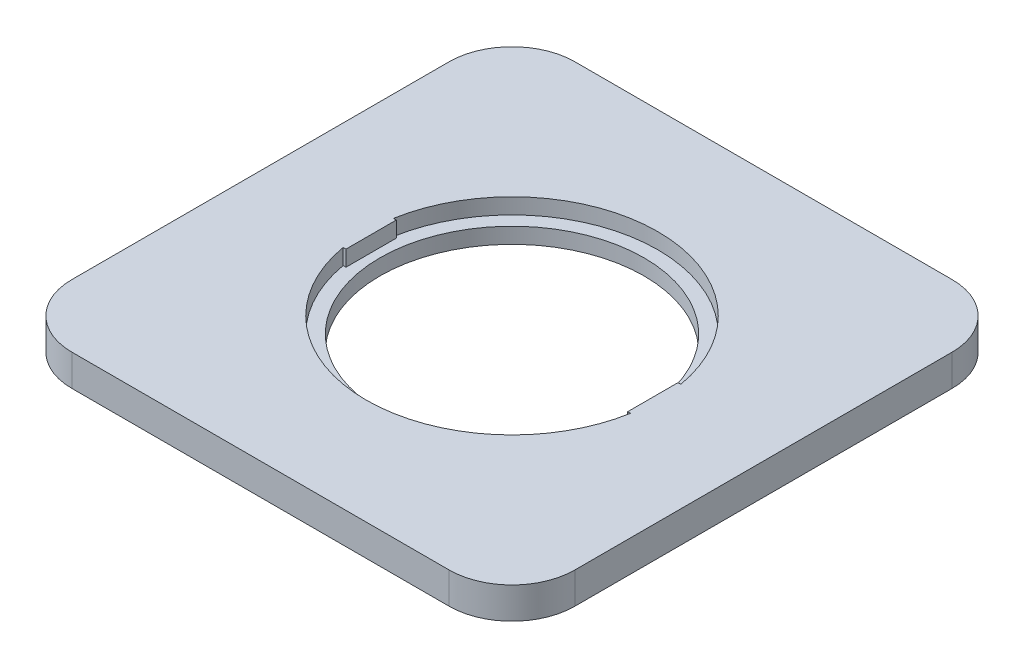
ISO-10303-21;
HEADER;
FILE_DESCRIPTION(('STEP AP214'),'2;1');
FILE_NAME('part.step','',(''),(''),'','','');
FILE_SCHEMA(('AUTOMOTIVE_DESIGN { 1 0 10303 214 1 1 1 1 }'));
ENDSEC;
DATA;
#1=APPLICATION_CONTEXT('core data for automotive mechanical design processes');
#2=APPLICATION_PROTOCOL_DEFINITION('international standard','automotive_design',2000,#1);
#3=PRODUCT_CONTEXT('',#1,'mechanical');
#4=PRODUCT('Part','Part','',(#3));
#5=PRODUCT_RELATED_PRODUCT_CATEGORY('part','',(#4));
#6=PRODUCT_DEFINITION_FORMATION('','',#4);
#7=PRODUCT_DEFINITION_CONTEXT('part definition',#1,'design');
#8=PRODUCT_DEFINITION('design','',#6,#7);
#9=PRODUCT_DEFINITION_SHAPE('','',#8);
#10=(LENGTH_UNIT() NAMED_UNIT(*) SI_UNIT(.MILLI.,.METRE.));
#11=(NAMED_UNIT(*) PLANE_ANGLE_UNIT() SI_UNIT($,.RADIAN.));
#12=(NAMED_UNIT(*) SI_UNIT($,.STERADIAN.) SOLID_ANGLE_UNIT());
#13=UNCERTAINTY_MEASURE_WITH_UNIT(LENGTH_MEASURE(1.E-05),#10,'distance_accuracy_value','');
#14=(GEOMETRIC_REPRESENTATION_CONTEXT(3) GLOBAL_UNCERTAINTY_ASSIGNED_CONTEXT((#13)) GLOBAL_UNIT_ASSIGNED_CONTEXT((#10,
#11,#12)) REPRESENTATION_CONTEXT('',''));
#15=CARTESIAN_POINT('',(0.,0.,0.));
#16=DIRECTION('',(0.,0.,1.));
#17=DIRECTION('',(1.,0.,0.));
#18=AXIS2_PLACEMENT_3D('',#15,#16,#17);
#19=CARTESIAN_POINT('',(0.,2.5,0.));
#20=DIRECTION('',(0.,1.,0.));
#21=DIRECTION('',(0.,0.,1.));
#22=AXIS2_PLACEMENT_3D('',#19,#20,#21);
#23=PLANE('',#22);
#24=CARTESIAN_POINT('',(0.,2.5,0.));
#25=DIRECTION('',(0.,1.,0.));
#26=DIRECTION('',(0.,0.,1.));
#27=AXIS2_PLACEMENT_3D('',#24,#25,#26);
#28=CIRCLE('',#27,21.);
#29=CARTESIAN_POINT('',(0.,2.5,21.));
#30=VERTEX_POINT('',#29);
#31=EDGE_CURVE('E40',#30,#30,#28,.F.);
#32=ORIENTED_EDGE('',*,*,#31,.T.);
#33=EDGE_LOOP('',(#32));
#34=FACE_BOUND('',#33,.T.);
#35=DIRECTION('',(0.,0.,1.));
#36=VECTOR('',#35,1.);
#37=CARTESIAN_POINT('',(22.4,2.5,-4.));
#38=LINE('',#37,#36);
#39=CARTESIAN_POINT('',(22.4,2.5,-4.));
#40=VERTEX_POINT('',#39);
#41=CARTESIAN_POINT('',(22.4,2.5,4.));
#42=VERTEX_POINT('',#41);
#43=EDGE_CURVE('E53',#40,#42,#38,.T.);
#44=ORIENTED_EDGE('',*,*,#43,.F.);
#45=DIRECTION('',(-1.,0.,0.));
#46=VECTOR('',#45,1.);
#47=CARTESIAN_POINT('',(23.2,2.5,-4.));
#48=LINE('',#47,#46);
#49=CARTESIAN_POINT('',(22.8525709713371,2.5,-4.));
#50=VERTEX_POINT('',#49);
#51=EDGE_CURVE('E173',#50,#40,#48,.T.);
#52=ORIENTED_EDGE('',*,*,#51,.F.);
#53=CARTESIAN_POINT('',(0.,2.5,0.));
#54=DIRECTION('',(0.,1.,0.));
#55=DIRECTION('',(0.,0.,1.));
#56=AXIS2_PLACEMENT_3D('',#53,#54,#55);
#57=CIRCLE('',#56,23.2);
#58=CARTESIAN_POINT('',(-22.8525709713371,2.5,-4.00000000000016));
#59=VERTEX_POINT('',#58);
#60=EDGE_CURVE('E217',#50,#59,#57,.T.);
#61=ORIENTED_EDGE('',*,*,#60,.T.);
#62=DIRECTION('',(-1.,0.,0.));
#63=VECTOR('',#62,1.);
#64=CARTESIAN_POINT('',(0.,2.5,-3.99999999999999));
#65=LINE('',#64,#63);
#66=CARTESIAN_POINT('',(-22.4,2.5,-4.00000000000016));
#67=VERTEX_POINT('',#66);
#68=EDGE_CURVE('E192',#67,#59,#65,.T.);
#69=ORIENTED_EDGE('',*,*,#68,.F.);
#70=DIRECTION('',(0.,0.,-1.));
#71=VECTOR('',#70,1.);
#72=CARTESIAN_POINT('',(-22.4,2.5,-1.55431223447522E-13));
#73=LINE('',#72,#71);
#74=CARTESIAN_POINT('',(-22.4,2.5,3.99999999999984));
#75=VERTEX_POINT('',#74);
#76=EDGE_CURVE('E197',#75,#67,#73,.T.);
#77=ORIENTED_EDGE('',*,*,#76,.F.);
#78=DIRECTION('',(1.,0.,0.));
#79=VECTOR('',#78,1.);
#80=CARTESIAN_POINT('',(0.,2.5,4.00000000000001));
#81=LINE('',#80,#79);
#82=CARTESIAN_POINT('',(-22.8525709713371,2.5,3.99999999999984));
#83=VERTEX_POINT('',#82);
#84=EDGE_CURVE('E187',#83,#75,#81,.T.);
#85=ORIENTED_EDGE('',*,*,#84,.F.);
#86=CARTESIAN_POINT('',(22.8525709713371,2.5,4.));
#87=VERTEX_POINT('',#86);
#88=EDGE_CURVE('E215',#83,#87,#57,.T.);
#89=ORIENTED_EDGE('',*,*,#88,.T.);
#90=DIRECTION('',(1.,0.,0.));
#91=VECTOR('',#90,1.);
#92=CARTESIAN_POINT('',(22.4,2.5,4.));
#93=LINE('',#92,#91);
#94=EDGE_CURVE('E58',#42,#87,#93,.T.);
#95=ORIENTED_EDGE('',*,*,#94,.F.);
#96=EDGE_LOOP('',(#44,#52,#61,#69,#77,#85,#89,#95));
#97=FACE_BOUND('',#96,.T.);
#98=ADVANCED_FACE('F36',(#34,#97),#23,.T.);
#99=CARTESIAN_POINT('',(0.,2.5,0.));
#100=DIRECTION('',(0.,1.,0.));
#101=DIRECTION('',(0.,0.,1.));
#102=AXIS2_PLACEMENT_3D('',#99,#100,#101);
#103=CYLINDRICAL_SURFACE('',#102,23.2);
#104=DIRECTION('',(0.,1.,0.));
#105=VECTOR('',#104,1.);
#106=CARTESIAN_POINT('',(22.8525709713371,2.5,-4.));
#107=LINE('',#106,#105);
#108=CARTESIAN_POINT('',(22.8525709713371,5.,-4.));
#109=VERTEX_POINT('',#108);
#110=EDGE_CURVE('E184',#109,#50,#107,.F.);
#111=ORIENTED_EDGE('',*,*,#110,.F.);
#112=CARTESIAN_POINT('',(0.,5.,0.));
#113=DIRECTION('',(0.,1.,0.));
#114=DIRECTION('',(0.,0.,1.));
#115=AXIS2_PLACEMENT_3D('',#112,#113,#114);
#116=CIRCLE('',#115,23.2);
#117=CARTESIAN_POINT('',(-22.8525709713371,5.,-4.00000000000016));
#118=VERTEX_POINT('',#117);
#119=EDGE_CURVE('E159',#109,#118,#116,.T.);
#120=ORIENTED_EDGE('',*,*,#119,.T.);
#121=DIRECTION('',(0.,-1.,0.));
#122=VECTOR('',#121,1.);
#123=CARTESIAN_POINT('',(-22.8525709713371,13.0399004968967,-4.00000000000016));
#124=LINE('',#123,#122);
#125=EDGE_CURVE('E195',#118,#59,#124,.T.);
#126=ORIENTED_EDGE('',*,*,#125,.T.);
#127=ORIENTED_EDGE('',*,*,#60,.F.);
#128=EDGE_LOOP('',(#111,#120,#126,#127));
#129=FACE_BOUND('',#128,.T.);
#130=ADVANCED_FACE('F292',(#129),#103,.F.);
#131=DIRECTION('',(0.,1.,0.));
#132=VECTOR('',#131,1.);
#133=CARTESIAN_POINT('',(22.8525709713371,2.5,4.));
#134=LINE('',#133,#132);
#135=CARTESIAN_POINT('',(22.8525709713371,5.,4.));
#136=VERTEX_POINT('',#135);
#137=EDGE_CURVE('E175',#87,#136,#134,.T.);
#138=ORIENTED_EDGE('',*,*,#137,.F.);
#139=ORIENTED_EDGE('',*,*,#88,.F.);
#140=DIRECTION('',(0.,-1.,0.));
#141=VECTOR('',#140,1.);
#142=CARTESIAN_POINT('',(-22.8525709713371,13.0399004968967,3.99999999999984));
#143=LINE('',#142,#141);
#144=CARTESIAN_POINT('',(-22.8525709713371,5.,3.99999999999984));
#145=VERTEX_POINT('',#144);
#146=EDGE_CURVE('E191',#145,#83,#143,.T.);
#147=ORIENTED_EDGE('',*,*,#146,.F.);
#148=EDGE_CURVE('E218',#145,#136,#116,.T.);
#149=ORIENTED_EDGE('',*,*,#148,.T.);
#150=EDGE_LOOP('',(#138,#139,#147,#149));
#151=FACE_BOUND('',#150,.T.);
#152=ADVANCED_FACE('F283',(#151),#103,.F.);
#153=CARTESIAN_POINT('',(0.,-3.,0.));
#154=DIRECTION('',(0.,1.,0.));
#155=DIRECTION('',(0.,0.,1.));
#156=AXIS2_PLACEMENT_3D('',#153,#154,#155);
#157=CYLINDRICAL_SURFACE('',#156,21.);
#158=CARTESIAN_POINT('',(0.,0.,0.));
#159=DIRECTION('',(0.,1.,0.));
#160=DIRECTION('',(0.,0.,1.));
#161=AXIS2_PLACEMENT_3D('',#158,#159,#160);
#162=CIRCLE('',#161,21.);
#163=CARTESIAN_POINT('',(0.,0.,21.));
#164=VERTEX_POINT('',#163);
#165=EDGE_CURVE('E243',#164,#164,#162,.T.);
#166=ORIENTED_EDGE('',*,*,#165,.F.);
#167=EDGE_LOOP('',(#166));
#168=FACE_BOUND('',#167,.T.);
#169=ORIENTED_EDGE('',*,*,#31,.F.);
#170=EDGE_LOOP('',(#169));
#171=FACE_BOUND('',#170,.T.);
#172=ADVANCED_FACE('F281',(#168,#171),#157,.F.);
#173=CARTESIAN_POINT('',(30.,5.,30.));
#174=DIRECTION('',(0.,-1.,0.));
#175=DIRECTION('',(0.,0.,-1.));
#176=AXIS2_PLACEMENT_3D('',#173,#174,#175);
#177=CYLINDRICAL_SURFACE('',#176,10.);
#178=CARTESIAN_POINT('',(30.,0.,30.));
#179=DIRECTION('',(0.,1.,0.));
#180=DIRECTION('',(0.,0.,1.));
#181=AXIS2_PLACEMENT_3D('',#178,#179,#180);
#182=CIRCLE('',#181,10.);
#183=CARTESIAN_POINT('',(29.9999999999999,0.,40.));
#184=VERTEX_POINT('',#183);
#185=CARTESIAN_POINT('',(40.,0.,29.9999999999999));
#186=VERTEX_POINT('',#185);
#187=EDGE_CURVE('E239',#184,#186,#182,.T.);
#188=ORIENTED_EDGE('',*,*,#187,.T.);
#189=DIRECTION('',(0.,-1.,0.));
#190=VECTOR('',#189,1.);
#191=CARTESIAN_POINT('',(40.,5.,29.9999999999999));
#192=LINE('',#191,#190);
#193=CARTESIAN_POINT('',(40.,5.,29.9999999999999));
#194=VERTEX_POINT('',#193);
#195=EDGE_CURVE('E11',#194,#186,#192,.T.);
#196=ORIENTED_EDGE('',*,*,#195,.F.);
#197=CARTESIAN_POINT('',(30.,5.,30.));
#198=DIRECTION('',(0.,1.,0.));
#199=DIRECTION('',(0.,0.,1.));
#200=AXIS2_PLACEMENT_3D('',#197,#198,#199);
#201=CIRCLE('',#200,10.);
#202=CARTESIAN_POINT('',(29.9999999999999,5.,40.));
#203=VERTEX_POINT('',#202);
#204=EDGE_CURVE('E220',#203,#194,#201,.T.);
#205=ORIENTED_EDGE('',*,*,#204,.F.);
#206=DIRECTION('',(0.,-1.,0.));
#207=VECTOR('',#206,1.);
#208=CARTESIAN_POINT('',(29.9999999999999,5.,40.));
#209=LINE('',#208,#207);
#210=EDGE_CURVE('E238',#203,#184,#209,.T.);
#211=ORIENTED_EDGE('',*,*,#210,.T.);
#212=EDGE_LOOP('',(#188,#196,#205,#211));
#213=FACE_BOUND('',#212,.T.);
#214=ADVANCED_FACE('F38',(#213),#177,.T.);
#215=CARTESIAN_POINT('',(40.,5.,29.9999999999999));
#216=DIRECTION('',(-1.,0.,0.));
#217=DIRECTION('',(0.,0.,1.));
#218=AXIS2_PLACEMENT_3D('',#215,#216,#217);
#219=PLANE('',#218);
#220=DIRECTION('',(0.,0.,-1.));
#221=VECTOR('',#220,1.);
#222=CARTESIAN_POINT('',(40.,0.,29.9999999999999));
#223=LINE('',#222,#221);
#224=CARTESIAN_POINT('',(40.,0.,-29.9999999999999));
#225=VERTEX_POINT('',#224);
#226=EDGE_CURVE('E242',#186,#225,#223,.T.);
#227=ORIENTED_EDGE('',*,*,#226,.T.);
#228=DIRECTION('',(0.,-1.,0.));
#229=VECTOR('',#228,1.);
#230=CARTESIAN_POINT('',(40.,5.,-29.9999999999999));
#231=LINE('',#230,#229);
#232=CARTESIAN_POINT('',(40.,5.,-29.9999999999999));
#233=VERTEX_POINT('',#232);
#234=EDGE_CURVE('E45',#233,#225,#231,.T.);
#235=ORIENTED_EDGE('',*,*,#234,.F.);
#236=DIRECTION('',(0.,0.,-1.));
#237=VECTOR('',#236,1.);
#238=CARTESIAN_POINT('',(40.,5.,29.9999999999999));
#239=LINE('',#238,#237);
#240=EDGE_CURVE('E223',#194,#233,#239,.T.);
#241=ORIENTED_EDGE('',*,*,#240,.F.);
#242=ORIENTED_EDGE('',*,*,#195,.T.);
#243=EDGE_LOOP('',(#227,#235,#241,#242));
#244=FACE_BOUND('',#243,.T.);
#245=ADVANCED_FACE('F290',(#244),#219,.F.);
#246=CARTESIAN_POINT('',(30.,5.,-30.));
#247=DIRECTION('',(0.,-1.,0.));
#248=DIRECTION('',(0.,0.,-1.));
#249=AXIS2_PLACEMENT_3D('',#246,#247,#248);
#250=CYLINDRICAL_SURFACE('',#249,10.);
#251=CARTESIAN_POINT('',(30.,0.,-30.));
#252=DIRECTION('',(0.,1.,0.));
#253=DIRECTION('',(0.,0.,-1.));
#254=AXIS2_PLACEMENT_3D('',#251,#252,#253);
#255=CIRCLE('',#254,10.);
#256=CARTESIAN_POINT('',(29.9999999999999,0.,-40.));
#257=VERTEX_POINT('',#256);
#258=EDGE_CURVE('E245',#225,#257,#255,.T.);
#259=ORIENTED_EDGE('',*,*,#258,.T.);
#260=DIRECTION('',(0.,-1.,0.));
#261=VECTOR('',#260,1.);
#262=CARTESIAN_POINT('',(29.9999999999999,5.,-40.));
#263=LINE('',#262,#261);
#264=CARTESIAN_POINT('',(29.9999999999999,5.,-40.));
#265=VERTEX_POINT('',#264);
#266=EDGE_CURVE('E270',#265,#257,#263,.T.);
#267=ORIENTED_EDGE('',*,*,#266,.F.);
#268=CARTESIAN_POINT('',(30.,5.,-30.));
#269=DIRECTION('',(0.,1.,0.));
#270=DIRECTION('',(0.,0.,-1.));
#271=AXIS2_PLACEMENT_3D('',#268,#269,#270);
#272=CIRCLE('',#271,10.);
#273=EDGE_CURVE('E226',#233,#265,#272,.T.);
#274=ORIENTED_EDGE('',*,*,#273,.F.);
#275=ORIENTED_EDGE('',*,*,#234,.T.);
#276=EDGE_LOOP('',(#259,#267,#274,#275));
#277=FACE_BOUND('',#276,.T.);
#278=ADVANCED_FACE('F442',(#277),#250,.T.);
#279=CARTESIAN_POINT('',(-29.9999999999999,5.,-40.));
#280=DIRECTION('',(0.,0.,1.));
#281=DIRECTION('',(1.,0.,0.));
#282=AXIS2_PLACEMENT_3D('',#279,#280,#281);
#283=PLANE('',#282);
#284=DIRECTION('',(-1.,0.,0.));
#285=VECTOR('',#284,1.);
#286=CARTESIAN_POINT('',(-29.9999999999999,0.,-40.));
#287=LINE('',#286,#285);
#288=CARTESIAN_POINT('',(-30.,0.,-40.));
#289=VERTEX_POINT('',#288);
#290=EDGE_CURVE('E247',#257,#289,#287,.T.);
#291=ORIENTED_EDGE('',*,*,#290,.T.);
#292=DIRECTION('',(0.,-1.,0.));
#293=VECTOR('',#292,1.);
#294=CARTESIAN_POINT('',(-30.,5.,-40.));
#295=LINE('',#294,#293);
#296=CARTESIAN_POINT('',(-30.,5.,-40.));
#297=VERTEX_POINT('',#296);
#298=EDGE_CURVE('E267',#297,#289,#295,.T.);
#299=ORIENTED_EDGE('',*,*,#298,.F.);
#300=DIRECTION('',(-1.,0.,0.));
#301=VECTOR('',#300,1.);
#302=CARTESIAN_POINT('',(-29.9999999999999,5.,-40.));
#303=LINE('',#302,#301);
#304=EDGE_CURVE('E228',#265,#297,#303,.T.);
#305=ORIENTED_EDGE('',*,*,#304,.F.);
#306=ORIENTED_EDGE('',*,*,#266,.T.);
#307=EDGE_LOOP('',(#291,#299,#305,#306));
#308=FACE_BOUND('',#307,.T.);
#309=ADVANCED_FACE('F432',(#308),#283,.F.);
#310=CARTESIAN_POINT('',(-30.,5.,-30.));
#311=DIRECTION('',(0.,-1.,0.));
#312=DIRECTION('',(0.,0.,-1.));
#313=AXIS2_PLACEMENT_3D('',#310,#311,#312);
#314=CYLINDRICAL_SURFACE('',#313,10.);
#315=CARTESIAN_POINT('',(-30.,0.,-30.));
#316=DIRECTION('',(0.,1.,0.));
#317=DIRECTION('',(0.,0.,-1.));
#318=AXIS2_PLACEMENT_3D('',#315,#316,#317);
#319=CIRCLE('',#318,10.);
#320=CARTESIAN_POINT('',(-40.,0.,-29.9999999999999));
#321=VERTEX_POINT('',#320);
#322=EDGE_CURVE('E249',#289,#321,#319,.T.);
#323=ORIENTED_EDGE('',*,*,#322,.T.);
#324=DIRECTION('',(0.,-1.,0.));
#325=VECTOR('',#324,1.);
#326=CARTESIAN_POINT('',(-40.,5.,-29.9999999999999));
#327=LINE('',#326,#325);
#328=CARTESIAN_POINT('',(-40.,5.,-29.9999999999999));
#329=VERTEX_POINT('',#328);
#330=EDGE_CURVE('E264',#329,#321,#327,.T.);
#331=ORIENTED_EDGE('',*,*,#330,.F.);
#332=CARTESIAN_POINT('',(-30.,5.,-30.));
#333=DIRECTION('',(0.,1.,0.));
#334=DIRECTION('',(0.,0.,-1.));
#335=AXIS2_PLACEMENT_3D('',#332,#333,#334);
#336=CIRCLE('',#335,10.);
#337=EDGE_CURVE('E230',#297,#329,#336,.T.);
#338=ORIENTED_EDGE('',*,*,#337,.F.);
#339=ORIENTED_EDGE('',*,*,#298,.T.);
#340=EDGE_LOOP('',(#323,#331,#338,#339));
#341=FACE_BOUND('',#340,.T.);
#342=ADVANCED_FACE('F422',(#341),#314,.T.);
#343=CARTESIAN_POINT('',(-40.,5.,29.9999999999999));
#344=DIRECTION('',(1.,0.,0.));
#345=DIRECTION('',(0.,0.,-1.));
#346=AXIS2_PLACEMENT_3D('',#343,#344,#345);
#347=PLANE('',#346);
#348=DIRECTION('',(0.,0.,1.));
#349=VECTOR('',#348,1.);
#350=CARTESIAN_POINT('',(-40.,0.,29.9999999999999));
#351=LINE('',#350,#349);
#352=CARTESIAN_POINT('',(-40.,0.,29.9999999999999));
#353=VERTEX_POINT('',#352);
#354=EDGE_CURVE('E251',#321,#353,#351,.T.);
#355=ORIENTED_EDGE('',*,*,#354,.T.);
#356=DIRECTION('',(0.,-1.,0.));
#357=VECTOR('',#356,1.);
#358=CARTESIAN_POINT('',(-40.,5.,29.9999999999999));
#359=LINE('',#358,#357);
#360=CARTESIAN_POINT('',(-40.,5.,29.9999999999999));
#361=VERTEX_POINT('',#360);
#362=EDGE_CURVE('E261',#361,#353,#359,.T.);
#363=ORIENTED_EDGE('',*,*,#362,.F.);
#364=DIRECTION('',(0.,0.,1.));
#365=VECTOR('',#364,1.);
#366=CARTESIAN_POINT('',(-40.,5.,29.9999999999999));
#367=LINE('',#366,#365);
#368=EDGE_CURVE('E232',#329,#361,#367,.T.);
#369=ORIENTED_EDGE('',*,*,#368,.F.);
#370=ORIENTED_EDGE('',*,*,#330,.T.);
#371=EDGE_LOOP('',(#355,#363,#369,#370));
#372=FACE_BOUND('',#371,.T.);
#373=ADVANCED_FACE('F412',(#372),#347,.F.);
#374=CARTESIAN_POINT('',(-30.,5.,30.));
#375=DIRECTION('',(0.,-1.,0.));
#376=DIRECTION('',(0.,0.,-1.));
#377=AXIS2_PLACEMENT_3D('',#374,#375,#376);
#378=CYLINDRICAL_SURFACE('',#377,10.);
#379=CARTESIAN_POINT('',(-30.,0.,30.));
#380=DIRECTION('',(0.,1.,0.));
#381=DIRECTION('',(0.,0.,-1.));
#382=AXIS2_PLACEMENT_3D('',#379,#380,#381);
#383=CIRCLE('',#382,10.);
#384=CARTESIAN_POINT('',(-29.9999999999999,0.,40.));
#385=VERTEX_POINT('',#384);
#386=EDGE_CURVE('E253',#353,#385,#383,.T.);
#387=ORIENTED_EDGE('',*,*,#386,.T.);
#388=DIRECTION('',(0.,-1.,0.));
#389=VECTOR('',#388,1.);
#390=CARTESIAN_POINT('',(-29.9999999999999,5.,40.));
#391=LINE('',#390,#389);
#392=CARTESIAN_POINT('',(-29.9999999999999,5.,40.));
#393=VERTEX_POINT('',#392);
#394=EDGE_CURVE('E258',#393,#385,#391,.T.);
#395=ORIENTED_EDGE('',*,*,#394,.F.);
#396=CARTESIAN_POINT('',(-30.,5.,30.));
#397=DIRECTION('',(0.,1.,0.));
#398=DIRECTION('',(0.,0.,-1.));
#399=AXIS2_PLACEMENT_3D('',#396,#397,#398);
#400=CIRCLE('',#399,10.);
#401=EDGE_CURVE('E234',#361,#393,#400,.T.);
#402=ORIENTED_EDGE('',*,*,#401,.F.);
#403=ORIENTED_EDGE('',*,*,#362,.T.);
#404=EDGE_LOOP('',(#387,#395,#402,#403));
#405=FACE_BOUND('',#404,.T.);
#406=ADVANCED_FACE('F402',(#405),#378,.T.);
#407=CARTESIAN_POINT('',(-29.9999999999999,5.,40.));
#408=DIRECTION('',(0.,0.,-1.));
#409=DIRECTION('',(-1.,0.,0.));
#410=AXIS2_PLACEMENT_3D('',#407,#408,#409);
#411=PLANE('',#410);
#412=DIRECTION('',(1.,0.,0.));
#413=VECTOR('',#412,1.);
#414=CARTESIAN_POINT('',(-29.9999999999999,0.,40.));
#415=LINE('',#414,#413);
#416=EDGE_CURVE('E224',#385,#184,#415,.T.);
#417=ORIENTED_EDGE('',*,*,#416,.T.);
#418=ORIENTED_EDGE('',*,*,#210,.F.);
#419=DIRECTION('',(1.,0.,0.));
#420=VECTOR('',#419,1.);
#421=CARTESIAN_POINT('',(-29.9999999999999,5.,40.));
#422=LINE('',#421,#420);
#423=EDGE_CURVE('E236',#393,#203,#422,.T.);
#424=ORIENTED_EDGE('',*,*,#423,.F.);
#425=ORIENTED_EDGE('',*,*,#394,.T.);
#426=EDGE_LOOP('',(#417,#418,#424,#425));
#427=FACE_BOUND('',#426,.T.);
#428=ADVANCED_FACE('F363',(#427),#411,.F.);
#429=CARTESIAN_POINT('',(30.,5.,30.));
#430=DIRECTION('',(0.,1.,0.));
#431=DIRECTION('',(0.,0.,1.));
#432=AXIS2_PLACEMENT_3D('',#429,#430,#431);
#433=PLANE('',#432);
#434=ORIENTED_EDGE('',*,*,#119,.F.);
#435=DIRECTION('',(-1.,0.,0.));
#436=VECTOR('',#435,1.);
#437=CARTESIAN_POINT('',(23.2,5.,-4.));
#438=LINE('',#437,#436);
#439=CARTESIAN_POINT('',(22.4,5.,-4.));
#440=VERTEX_POINT('',#439);
#441=EDGE_CURVE('E152',#109,#440,#438,.T.);
#442=ORIENTED_EDGE('',*,*,#441,.T.);
#443=DIRECTION('',(0.,0.,1.));
#444=VECTOR('',#443,1.);
#445=CARTESIAN_POINT('',(22.4,5.,-4.));
#446=LINE('',#445,#444);
#447=CARTESIAN_POINT('',(22.4,5.,4.));
#448=VERTEX_POINT('',#447);
#449=EDGE_CURVE('E157',#440,#448,#446,.T.);
#450=ORIENTED_EDGE('',*,*,#449,.T.);
#451=DIRECTION('',(1.,0.,0.));
#452=VECTOR('',#451,1.);
#453=CARTESIAN_POINT('',(22.4,5.,4.));
#454=LINE('',#453,#452);
#455=EDGE_CURVE('E163',#448,#136,#454,.T.);
#456=ORIENTED_EDGE('',*,*,#455,.T.);
#457=ORIENTED_EDGE('',*,*,#148,.F.);
#458=DIRECTION('',(1.,0.,0.));
#459=VECTOR('',#458,1.);
#460=CARTESIAN_POINT('',(0.,5.,4.00000000000001));
#461=LINE('',#460,#459);
#462=CARTESIAN_POINT('',(-22.4,5.,3.99999999999984));
#463=VERTEX_POINT('',#462);
#464=EDGE_CURVE('E190',#145,#463,#461,.T.);
#465=ORIENTED_EDGE('',*,*,#464,.T.);
#466=DIRECTION('',(0.,0.,-1.));
#467=VECTOR('',#466,1.);
#468=CARTESIAN_POINT('',(-22.4,5.,-1.55431223447522E-13));
#469=LINE('',#468,#467);
#470=CARTESIAN_POINT('',(-22.4,5.,-4.00000000000016));
#471=VERTEX_POINT('',#470);
#472=EDGE_CURVE('E202',#463,#471,#469,.T.);
#473=ORIENTED_EDGE('',*,*,#472,.T.);
#474=DIRECTION('',(-1.,0.,0.));
#475=VECTOR('',#474,1.);
#476=CARTESIAN_POINT('',(0.,5.,-3.99999999999999));
#477=LINE('',#476,#475);
#478=EDGE_CURVE('E200',#471,#118,#477,.T.);
#479=ORIENTED_EDGE('',*,*,#478,.T.);
#480=EDGE_LOOP('',(#434,#442,#450,#456,#457,#465,#473,#479));
#481=FACE_BOUND('',#480,.T.);
#482=ORIENTED_EDGE('',*,*,#204,.T.);
#483=ORIENTED_EDGE('',*,*,#240,.T.);
#484=ORIENTED_EDGE('',*,*,#273,.T.);
#485=ORIENTED_EDGE('',*,*,#304,.T.);
#486=ORIENTED_EDGE('',*,*,#337,.T.);
#487=ORIENTED_EDGE('',*,*,#368,.T.);
#488=ORIENTED_EDGE('',*,*,#401,.T.);
#489=ORIENTED_EDGE('',*,*,#423,.T.);
#490=EDGE_LOOP('',(#482,#483,#484,#485,#486,#487,#488,#489));
#491=FACE_BOUND('',#490,.T.);
#492=ADVANCED_FACE('F154',(#481,#491),#433,.T.);
#493=CARTESIAN_POINT('',(30.,0.,30.));
#494=DIRECTION('',(0.,1.,0.));
#495=DIRECTION('',(0.,0.,1.));
#496=AXIS2_PLACEMENT_3D('',#493,#494,#495);
#497=PLANE('',#496);
#498=ORIENTED_EDGE('',*,*,#165,.T.);
#499=EDGE_LOOP('',(#498));
#500=FACE_BOUND('',#499,.T.);
#501=ORIENTED_EDGE('',*,*,#187,.F.);
#502=ORIENTED_EDGE('',*,*,#416,.F.);
#503=ORIENTED_EDGE('',*,*,#386,.F.);
#504=ORIENTED_EDGE('',*,*,#354,.F.);
#505=ORIENTED_EDGE('',*,*,#322,.F.);
#506=ORIENTED_EDGE('',*,*,#290,.F.);
#507=ORIENTED_EDGE('',*,*,#258,.F.);
#508=ORIENTED_EDGE('',*,*,#226,.F.);
#509=EDGE_LOOP('',(#501,#502,#503,#504,#505,#506,#507,#508));
#510=FACE_BOUND('',#509,.T.);
#511=ADVANCED_FACE('F307',(#500,#510),#497,.F.);
#512=CARTESIAN_POINT('',(-22.4,13.0399004968967,-1.55431223447522E-13));
#513=DIRECTION('',(-1.,0.,0.));
#514=DIRECTION('',(0.,0.,1.));
#515=AXIS2_PLACEMENT_3D('',#512,#513,#514);
#516=PLANE('',#515);
#517=ORIENTED_EDGE('',*,*,#472,.F.);
#518=DIRECTION('',(0.,-1.,0.));
#519=VECTOR('',#518,1.);
#520=CARTESIAN_POINT('',(-22.4,13.0399004968967,3.99999999999984));
#521=LINE('',#520,#519);
#522=EDGE_CURVE('E186',#463,#75,#521,.T.);
#523=ORIENTED_EDGE('',*,*,#522,.T.);
#524=ORIENTED_EDGE('',*,*,#76,.T.);
#525=DIRECTION('',(0.,-1.,0.));
#526=VECTOR('',#525,1.);
#527=CARTESIAN_POINT('',(-22.4,13.0399004968967,-4.00000000000016));
#528=LINE('',#527,#526);
#529=EDGE_CURVE('E196',#471,#67,#528,.T.);
#530=ORIENTED_EDGE('',*,*,#529,.F.);
#531=EDGE_LOOP('',(#517,#523,#524,#530));
#532=FACE_BOUND('',#531,.T.);
#533=ADVANCED_FACE('F303',(#532),#516,.F.);
#534=CARTESIAN_POINT('',(0.,13.0399004968967,-3.99999999999999));
#535=DIRECTION('',(0.,0.,1.));
#536=DIRECTION('',(1.,0.,0.));
#537=AXIS2_PLACEMENT_3D('',#534,#535,#536);
#538=PLANE('',#537);
#539=ORIENTED_EDGE('',*,*,#478,.F.);
#540=ORIENTED_EDGE('',*,*,#529,.T.);
#541=ORIENTED_EDGE('',*,*,#68,.T.);
#542=ORIENTED_EDGE('',*,*,#125,.F.);
#543=EDGE_LOOP('',(#539,#540,#541,#542));
#544=FACE_BOUND('',#543,.T.);
#545=ADVANCED_FACE('F306',(#544),#538,.F.);
#546=CARTESIAN_POINT('',(0.,13.0399004968967,4.00000000000001));
#547=DIRECTION('',(0.,0.,-1.));
#548=DIRECTION('',(-1.,0.,0.));
#549=AXIS2_PLACEMENT_3D('',#546,#547,#548);
#550=PLANE('',#549);
#551=ORIENTED_EDGE('',*,*,#464,.F.);
#552=ORIENTED_EDGE('',*,*,#146,.T.);
#553=ORIENTED_EDGE('',*,*,#84,.T.);
#554=ORIENTED_EDGE('',*,*,#522,.F.);
#555=EDGE_LOOP('',(#551,#552,#553,#554));
#556=FACE_BOUND('',#555,.T.);
#557=ADVANCED_FACE('F311',(#556),#550,.F.);
#558=CARTESIAN_POINT('',(23.2,13.0399004968967,-4.));
#559=DIRECTION('',(0.,0.,1.));
#560=DIRECTION('',(1.,0.,0.));
#561=AXIS2_PLACEMENT_3D('',#558,#559,#560);
#562=PLANE('',#561);
#563=ORIENTED_EDGE('',*,*,#441,.F.);
#564=ORIENTED_EDGE('',*,*,#110,.T.);
#565=ORIENTED_EDGE('',*,*,#51,.T.);
#566=DIRECTION('',(0.,-1.,0.));
#567=VECTOR('',#566,1.);
#568=CARTESIAN_POINT('',(22.4,13.0399004968967,-4.));
#569=LINE('',#568,#567);
#570=EDGE_CURVE('E168',#440,#40,#569,.T.);
#571=ORIENTED_EDGE('',*,*,#570,.F.);
#572=EDGE_LOOP('',(#563,#564,#565,#571));
#573=FACE_BOUND('',#572,.T.);
#574=ADVANCED_FACE('F172',(#573),#562,.F.);
#575=CARTESIAN_POINT('',(22.4,13.0399004968967,4.));
#576=DIRECTION('',(0.,0.,-1.));
#577=DIRECTION('',(-1.,0.,0.));
#578=AXIS2_PLACEMENT_3D('',#575,#576,#577);
#579=PLANE('',#578);
#580=ORIENTED_EDGE('',*,*,#94,.T.);
#581=ORIENTED_EDGE('',*,*,#137,.T.);
#582=ORIENTED_EDGE('',*,*,#455,.F.);
#583=DIRECTION('',(0.,-1.,0.));
#584=VECTOR('',#583,1.);
#585=CARTESIAN_POINT('',(22.4,13.0399004968967,4.));
#586=LINE('',#585,#584);
#587=EDGE_CURVE('E169',#448,#42,#586,.T.);
#588=ORIENTED_EDGE('',*,*,#587,.T.);
#589=EDGE_LOOP('',(#580,#581,#582,#588));
#590=FACE_BOUND('',#589,.T.);
#591=ADVANCED_FACE('F316',(#590),#579,.F.);
#592=CARTESIAN_POINT('',(22.4,13.0399004968967,-4.));
#593=DIRECTION('',(1.,0.,0.));
#594=DIRECTION('',(0.,0.,-1.));
#595=AXIS2_PLACEMENT_3D('',#592,#593,#594);
#596=PLANE('',#595);
#597=ORIENTED_EDGE('',*,*,#449,.F.);
#598=ORIENTED_EDGE('',*,*,#570,.T.);
#599=ORIENTED_EDGE('',*,*,#43,.T.);
#600=ORIENTED_EDGE('',*,*,#587,.F.);
#601=EDGE_LOOP('',(#597,#598,#599,#600));
#602=FACE_BOUND('',#601,.T.);
#603=ADVANCED_FACE('F167',(#602),#596,.F.);
#604=CLOSED_SHELL('',(#98,#130,#152,#172,#214,#245,#278,#309,#342,#373,#406,#428,#492,#511,#533,
#545,#557,#574,#591,#603));
#605=MANIFOLD_SOLID_BREP('B2',#604);
#606=ADVANCED_BREP_SHAPE_REPRESENTATION('',(#18,#605),#14);
#607=SHAPE_DEFINITION_REPRESENTATION(#9,#606);
ENDSEC;
END-ISO-10303-21;
